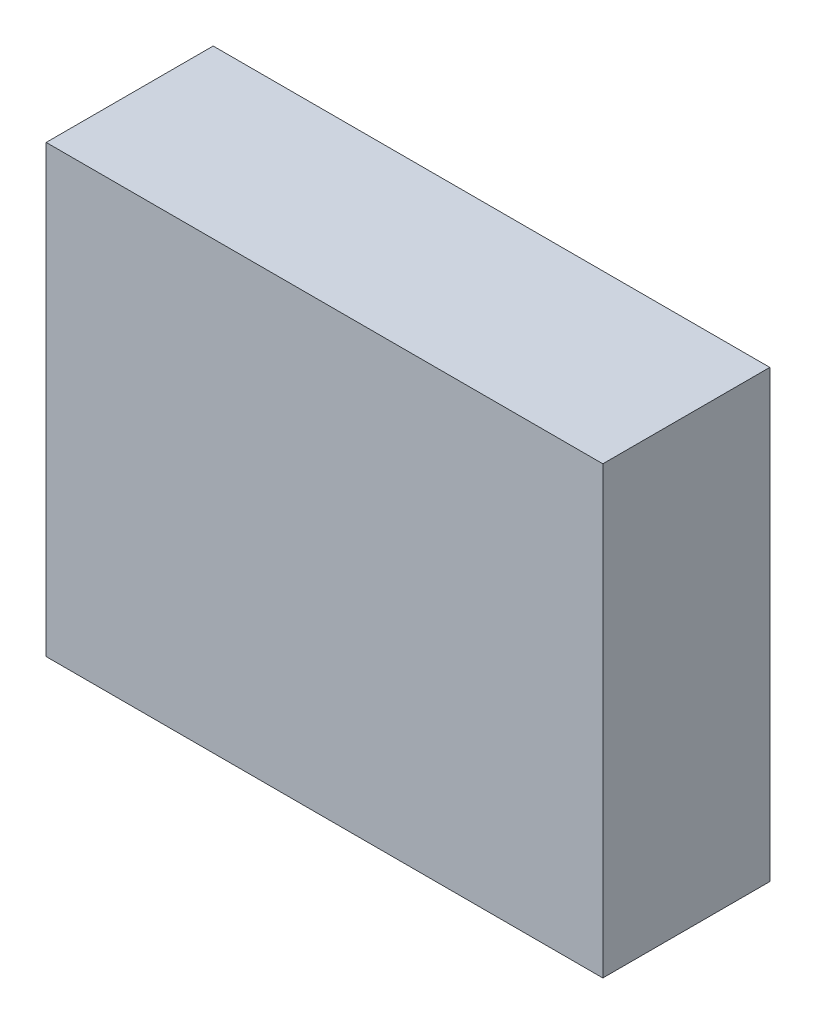
ISO-10303-21;
HEADER;
FILE_DESCRIPTION(('STEP AP214'),'2;1');
FILE_NAME('part.step','',(''),(''),'','','');
FILE_SCHEMA(('AUTOMOTIVE_DESIGN { 1 0 10303 214 1 1 1 1 }'));
ENDSEC;
DATA;
#1=APPLICATION_CONTEXT('core data for automotive mechanical design processes');
#2=APPLICATION_PROTOCOL_DEFINITION('international standard','automotive_design',2000,#1);
#3=PRODUCT_CONTEXT('',#1,'mechanical');
#4=PRODUCT('Part','Part','',(#3));
#5=PRODUCT_RELATED_PRODUCT_CATEGORY('part','',(#4));
#6=PRODUCT_DEFINITION_FORMATION('','',#4);
#7=PRODUCT_DEFINITION_CONTEXT('part definition',#1,'design');
#8=PRODUCT_DEFINITION('design','',#6,#7);
#9=PRODUCT_DEFINITION_SHAPE('','',#8);
#10=(LENGTH_UNIT() NAMED_UNIT(*) SI_UNIT(.MILLI.,.METRE.));
#11=(NAMED_UNIT(*) PLANE_ANGLE_UNIT() SI_UNIT($,.RADIAN.));
#12=(NAMED_UNIT(*) SI_UNIT($,.STERADIAN.) SOLID_ANGLE_UNIT());
#13=UNCERTAINTY_MEASURE_WITH_UNIT(LENGTH_MEASURE(1.E-05),#10,'distance_accuracy_value','');
#14=(GEOMETRIC_REPRESENTATION_CONTEXT(3) GLOBAL_UNCERTAINTY_ASSIGNED_CONTEXT((#13)) GLOBAL_UNIT_ASSIGNED_CONTEXT((#10,
#11,#12)) REPRESENTATION_CONTEXT('',''));
#15=CARTESIAN_POINT('',(0.,0.,0.));
#16=DIRECTION('',(0.,0.,1.));
#17=DIRECTION('',(1.,0.,0.));
#18=AXIS2_PLACEMENT_3D('',#15,#16,#17);
#19=CARTESIAN_POINT('',(15.875,-12.7,9.525));
#20=DIRECTION('',(-1.,0.,0.));
#21=DIRECTION('',(0.,0.,1.));
#22=AXIS2_PLACEMENT_3D('',#19,#20,#21);
#23=PLANE('',#22);
#24=DIRECTION('',(0.,1.,0.));
#25=VECTOR('',#24,1.);
#26=CARTESIAN_POINT('',(15.875,-12.7,0.));
#27=LINE('',#26,#25);
#28=CARTESIAN_POINT('',(15.875,-12.7,0.));
#29=VERTEX_POINT('',#28);
#30=CARTESIAN_POINT('',(15.875,12.7,0.));
#31=VERTEX_POINT('',#30);
#32=EDGE_CURVE('E98',#29,#31,#27,.T.);
#33=ORIENTED_EDGE('',*,*,#32,.T.);
#34=DIRECTION('',(0.,0.,-1.));
#35=VECTOR('',#34,1.);
#36=CARTESIAN_POINT('',(15.875,12.7,9.525));
#37=LINE('',#36,#35);
#38=CARTESIAN_POINT('',(15.875,12.7,9.525));
#39=VERTEX_POINT('',#38);
#40=EDGE_CURVE('E11',#39,#31,#37,.T.);
#41=ORIENTED_EDGE('',*,*,#40,.F.);
#42=DIRECTION('',(0.,1.,0.));
#43=VECTOR('',#42,1.);
#44=CARTESIAN_POINT('',(15.875,-12.7,9.525));
#45=LINE('',#44,#43);
#46=CARTESIAN_POINT('',(15.875,-12.7,9.525));
#47=VERTEX_POINT('',#46);
#48=EDGE_CURVE('E86',#47,#39,#45,.T.);
#49=ORIENTED_EDGE('',*,*,#48,.F.);
#50=DIRECTION('',(0.,0.,-1.));
#51=VECTOR('',#50,1.);
#52=CARTESIAN_POINT('',(15.875,-12.7,9.525));
#53=LINE('',#52,#51);
#54=EDGE_CURVE('E94',#47,#29,#53,.T.);
#55=ORIENTED_EDGE('',*,*,#54,.T.);
#56=EDGE_LOOP('',(#33,#41,#49,#55));
#57=FACE_BOUND('',#56,.T.);
#58=ADVANCED_FACE('F35',(#57),#23,.F.);
#59=CARTESIAN_POINT('',(-15.875,12.7,9.525));
#60=DIRECTION('',(0.,-1.,0.));
#61=DIRECTION('',(0.,0.,-1.));
#62=AXIS2_PLACEMENT_3D('',#59,#60,#61);
#63=PLANE('',#62);
#64=DIRECTION('',(-1.,0.,0.));
#65=VECTOR('',#64,1.);
#66=CARTESIAN_POINT('',(-15.875,12.7,0.));
#67=LINE('',#66,#65);
#68=CARTESIAN_POINT('',(-15.875,12.7,0.));
#69=VERTEX_POINT('',#68);
#70=EDGE_CURVE('E90',#31,#69,#67,.T.);
#71=ORIENTED_EDGE('',*,*,#70,.T.);
#72=DIRECTION('',(0.,0.,-1.));
#73=VECTOR('',#72,1.);
#74=CARTESIAN_POINT('',(-15.875,12.7,9.525));
#75=LINE('',#74,#73);
#76=CARTESIAN_POINT('',(-15.875,12.7,9.525));
#77=VERTEX_POINT('',#76);
#78=EDGE_CURVE('E43',#77,#69,#75,.T.);
#79=ORIENTED_EDGE('',*,*,#78,.F.);
#80=DIRECTION('',(-1.,0.,0.));
#81=VECTOR('',#80,1.);
#82=CARTESIAN_POINT('',(-15.875,12.7,9.525));
#83=LINE('',#82,#81);
#84=EDGE_CURVE('E81',#39,#77,#83,.T.);
#85=ORIENTED_EDGE('',*,*,#84,.F.);
#86=ORIENTED_EDGE('',*,*,#40,.T.);
#87=EDGE_LOOP('',(#71,#79,#85,#86));
#88=FACE_BOUND('',#87,.T.);
#89=ADVANCED_FACE('F89',(#88),#63,.F.);
#90=CARTESIAN_POINT('',(-15.875,-12.7,9.525));
#91=DIRECTION('',(1.,0.,0.));
#92=DIRECTION('',(0.,0.,-1.));
#93=AXIS2_PLACEMENT_3D('',#90,#91,#92);
#94=PLANE('',#93);
#95=DIRECTION('',(0.,-1.,0.));
#96=VECTOR('',#95,1.);
#97=CARTESIAN_POINT('',(-15.875,-12.7,0.));
#98=LINE('',#97,#96);
#99=CARTESIAN_POINT('',(-15.875,-12.7,0.));
#100=VERTEX_POINT('',#99);
#101=EDGE_CURVE('E68',#69,#100,#98,.T.);
#102=ORIENTED_EDGE('',*,*,#101,.T.);
#103=DIRECTION('',(0.,0.,-1.));
#104=VECTOR('',#103,1.);
#105=CARTESIAN_POINT('',(-15.875,-12.7,9.525));
#106=LINE('',#105,#104);
#107=CARTESIAN_POINT('',(-15.875,-12.7,9.525));
#108=VERTEX_POINT('',#107);
#109=EDGE_CURVE('E91',#108,#100,#106,.T.);
#110=ORIENTED_EDGE('',*,*,#109,.F.);
#111=DIRECTION('',(0.,-1.,0.));
#112=VECTOR('',#111,1.);
#113=CARTESIAN_POINT('',(-15.875,-12.7,9.525));
#114=LINE('',#113,#112);
#115=EDGE_CURVE('E84',#77,#108,#114,.T.);
#116=ORIENTED_EDGE('',*,*,#115,.F.);
#117=ORIENTED_EDGE('',*,*,#78,.T.);
#118=EDGE_LOOP('',(#102,#110,#116,#117));
#119=FACE_BOUND('',#118,.T.);
#120=ADVANCED_FACE('F92',(#119),#94,.F.);
#121=CARTESIAN_POINT('',(-15.875,-12.7,9.525));
#122=DIRECTION('',(0.,1.,0.));
#123=DIRECTION('',(0.,0.,1.));
#124=AXIS2_PLACEMENT_3D('',#121,#122,#123);
#125=PLANE('',#124);
#126=DIRECTION('',(1.,0.,0.));
#127=VECTOR('',#126,1.);
#128=CARTESIAN_POINT('',(-15.875,-12.7,0.));
#129=LINE('',#128,#127);
#130=EDGE_CURVE('E74',#100,#29,#129,.T.);
#131=ORIENTED_EDGE('',*,*,#130,.T.);
#132=ORIENTED_EDGE('',*,*,#54,.F.);
#133=DIRECTION('',(1.,0.,0.));
#134=VECTOR('',#133,1.);
#135=CARTESIAN_POINT('',(-15.875,-12.7,9.525));
#136=LINE('',#135,#134);
#137=EDGE_CURVE('E51',#108,#47,#136,.T.);
#138=ORIENTED_EDGE('',*,*,#137,.F.);
#139=ORIENTED_EDGE('',*,*,#109,.T.);
#140=EDGE_LOOP('',(#131,#132,#138,#139));
#141=FACE_BOUND('',#140,.T.);
#142=ADVANCED_FACE('F105',(#141),#125,.F.);
#143=CARTESIAN_POINT('',(0.,0.,9.525));
#144=DIRECTION('',(0.,0.,-1.));
#145=DIRECTION('',(-1.,0.,0.));
#146=AXIS2_PLACEMENT_3D('',#143,#144,#145);
#147=PLANE('',#146);
#148=ORIENTED_EDGE('',*,*,#48,.T.);
#149=ORIENTED_EDGE('',*,*,#84,.T.);
#150=ORIENTED_EDGE('',*,*,#115,.T.);
#151=ORIENTED_EDGE('',*,*,#137,.T.);
#152=EDGE_LOOP('',(#148,#149,#150,#151));
#153=FACE_BOUND('',#152,.T.);
#154=ADVANCED_FACE('F82',(#153),#147,.F.);
#155=CARTESIAN_POINT('',(0.,0.,0.));
#156=DIRECTION('',(0.,0.,-1.));
#157=DIRECTION('',(-1.,0.,0.));
#158=AXIS2_PLACEMENT_3D('',#155,#156,#157);
#159=PLANE('',#158);
#160=ORIENTED_EDGE('',*,*,#32,.F.);
#161=ORIENTED_EDGE('',*,*,#130,.F.);
#162=ORIENTED_EDGE('',*,*,#101,.F.);
#163=ORIENTED_EDGE('',*,*,#70,.F.);
#164=EDGE_LOOP('',(#160,#161,#162,#163));
#165=FACE_BOUND('',#164,.T.);
#166=ADVANCED_FACE('F108',(#165),#159,.T.);
#167=CLOSED_SHELL('',(#58,#89,#120,#142,#154,#166));
#168=MANIFOLD_SOLID_BREP('B2',#167);
#169=ADVANCED_BREP_SHAPE_REPRESENTATION('',(#18,#168),#14);
#170=SHAPE_DEFINITION_REPRESENTATION(#9,#169);
ENDSEC;
END-ISO-10303-21;
